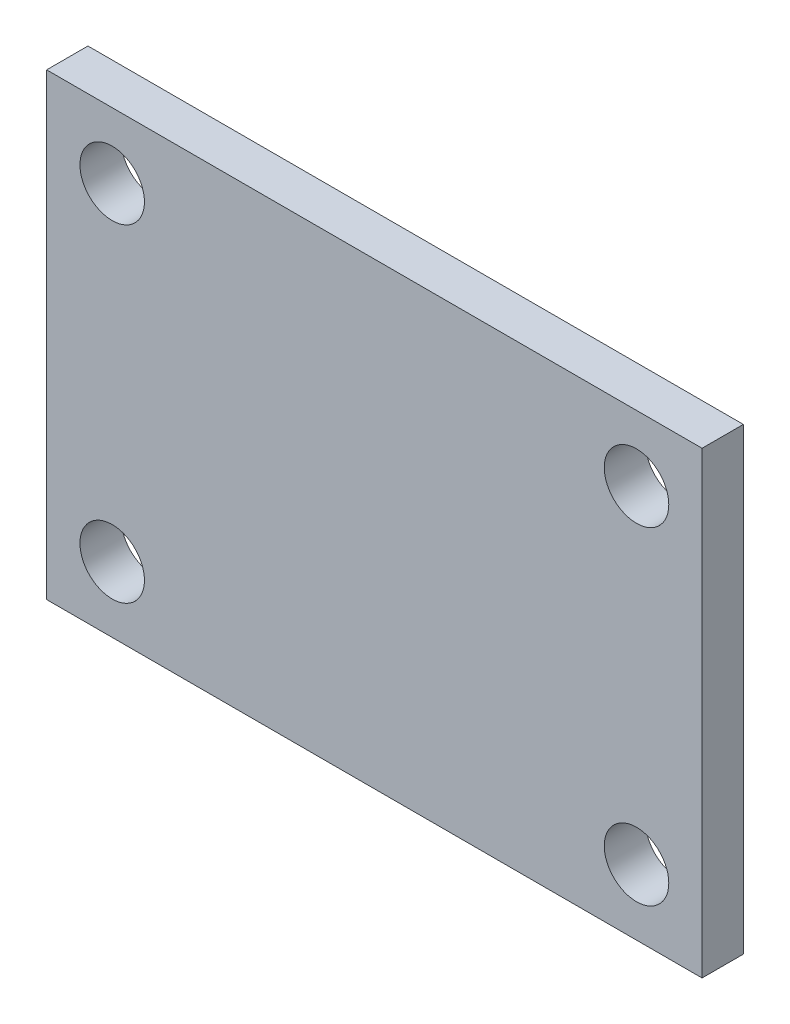
ISO-10303-21;
HEADER;
FILE_DESCRIPTION(('STEP AP214'),'2;1');
FILE_NAME('part.step','',(''),(''),'','','');
FILE_SCHEMA(('AUTOMOTIVE_DESIGN { 1 0 10303 214 1 1 1 1 }'));
ENDSEC;
DATA;
#1=APPLICATION_CONTEXT('core data for automotive mechanical design processes');
#2=APPLICATION_PROTOCOL_DEFINITION('international standard','automotive_design',2000,#1);
#3=PRODUCT_CONTEXT('',#1,'mechanical');
#4=PRODUCT('Part','Part','',(#3));
#5=PRODUCT_RELATED_PRODUCT_CATEGORY('part','',(#4));
#6=PRODUCT_DEFINITION_FORMATION('','',#4);
#7=PRODUCT_DEFINITION_CONTEXT('part definition',#1,'design');
#8=PRODUCT_DEFINITION('design','',#6,#7);
#9=PRODUCT_DEFINITION_SHAPE('','',#8);
#10=(LENGTH_UNIT() NAMED_UNIT(*) SI_UNIT(.MILLI.,.METRE.));
#11=(NAMED_UNIT(*) PLANE_ANGLE_UNIT() SI_UNIT($,.RADIAN.));
#12=(NAMED_UNIT(*) SI_UNIT($,.STERADIAN.) SOLID_ANGLE_UNIT());
#13=UNCERTAINTY_MEASURE_WITH_UNIT(LENGTH_MEASURE(1.E-05),#10,'distance_accuracy_value','');
#14=(GEOMETRIC_REPRESENTATION_CONTEXT(3) GLOBAL_UNCERTAINTY_ASSIGNED_CONTEXT((#13)) GLOBAL_UNIT_ASSIGNED_CONTEXT((#10,
#11,#12)) REPRESENTATION_CONTEXT('',''));
#15=CARTESIAN_POINT('',(0.,0.,0.));
#16=DIRECTION('',(0.,0.,1.));
#17=DIRECTION('',(1.,0.,0.));
#18=AXIS2_PLACEMENT_3D('',#15,#16,#17);
#19=CARTESIAN_POINT('',(0.,0.,-22.55));
#20=DIRECTION('',(0.,0.,-1.));
#21=DIRECTION('',(-1.,0.,0.));
#22=AXIS2_PLACEMENT_3D('',#19,#20,#21);
#23=PLANE('',#22);
#24=DIRECTION('',(0.,-1.,0.));
#25=VECTOR('',#24,1.);
#26=CARTESIAN_POINT('',(-0.2,-8.89,-22.55));
#27=LINE('',#26,#25);
#28=CARTESIAN_POINT('',(-0.2,8.89,-22.55));
#29=VERTEX_POINT('',#28);
#30=CARTESIAN_POINT('',(-0.2,-8.89,-22.55));
#31=VERTEX_POINT('',#30);
#32=EDGE_CURVE('E68',#29,#31,#27,.T.);
#33=ORIENTED_EDGE('',*,*,#32,.T.);
#34=DIRECTION('',(1.,0.,0.));
#35=VECTOR('',#34,1.);
#36=CARTESIAN_POINT('',(-0.2,-8.89,-22.55));
#37=LINE('',#36,#35);
#38=CARTESIAN_POINT('',(25.2,-8.89,-22.55));
#39=VERTEX_POINT('',#38);
#40=EDGE_CURVE('E64',#31,#39,#37,.T.);
#41=ORIENTED_EDGE('',*,*,#40,.T.);
#42=DIRECTION('',(0.,1.,0.));
#43=VECTOR('',#42,1.);
#44=CARTESIAN_POINT('',(25.2,-8.89,-22.55));
#45=LINE('',#44,#43);
#46=CARTESIAN_POINT('',(25.2,8.89,-22.55));
#47=VERTEX_POINT('',#46);
#48=EDGE_CURVE('E66',#39,#47,#45,.T.);
#49=ORIENTED_EDGE('',*,*,#48,.T.);
#50=DIRECTION('',(-1.,0.,0.));
#51=VECTOR('',#50,1.);
#52=CARTESIAN_POINT('',(-0.2,8.89,-22.55));
#53=LINE('',#52,#51);
#54=EDGE_CURVE('E31',#47,#29,#53,.T.);
#55=ORIENTED_EDGE('',*,*,#54,.T.);
#56=EDGE_LOOP('',(#33,#41,#49,#55));
#57=FACE_BOUND('',#56,.T.);
#58=CARTESIAN_POINT('',(2.34,6.35,-22.55));
#59=DIRECTION('',(0.,0.,1.));
#60=DIRECTION('',(1.,0.,0.));
#61=AXIS2_PLACEMENT_3D('',#58,#59,#60);
#62=CIRCLE('',#61,1.25);
#63=CARTESIAN_POINT('',(3.59,6.35,-22.55));
#64=VERTEX_POINT('',#63);
#65=EDGE_CURVE('E83',#64,#64,#62,.T.);
#66=ORIENTED_EDGE('',*,*,#65,.F.);
#67=EDGE_LOOP('',(#66));
#68=FACE_BOUND('',#67,.T.);
#69=CARTESIAN_POINT('',(22.66,6.35,-22.55));
#70=DIRECTION('',(0.,0.,1.));
#71=DIRECTION('',(1.,0.,0.));
#72=AXIS2_PLACEMENT_3D('',#69,#70,#71);
#73=CIRCLE('',#72,1.25);
#74=CARTESIAN_POINT('',(23.91,6.35,-22.55));
#75=VERTEX_POINT('',#74);
#76=EDGE_CURVE('E98',#75,#75,#73,.T.);
#77=ORIENTED_EDGE('',*,*,#76,.F.);
#78=EDGE_LOOP('',(#77));
#79=FACE_BOUND('',#78,.T.);
#80=CARTESIAN_POINT('',(2.34,-6.35,-22.55));
#81=DIRECTION('',(0.,0.,1.));
#82=DIRECTION('',(1.,0.,0.));
#83=AXIS2_PLACEMENT_3D('',#80,#81,#82);
#84=CIRCLE('',#83,1.25);
#85=CARTESIAN_POINT('',(3.59,-6.35,-22.55));
#86=VERTEX_POINT('',#85);
#87=EDGE_CURVE('E102',#86,#86,#84,.T.);
#88=ORIENTED_EDGE('',*,*,#87,.F.);
#89=EDGE_LOOP('',(#88));
#90=FACE_BOUND('',#89,.T.);
#91=CARTESIAN_POINT('',(22.66,-6.35,-22.55));
#92=DIRECTION('',(0.,0.,1.));
#93=DIRECTION('',(1.,0.,0.));
#94=AXIS2_PLACEMENT_3D('',#91,#92,#93);
#95=CIRCLE('',#94,1.25);
#96=CARTESIAN_POINT('',(23.91,-6.35,-22.55));
#97=VERTEX_POINT('',#96);
#98=EDGE_CURVE('E109',#97,#97,#95,.T.);
#99=ORIENTED_EDGE('',*,*,#98,.F.);
#100=EDGE_LOOP('',(#99));
#101=FACE_BOUND('',#100,.T.);
#102=ADVANCED_FACE('F16',(#57,#68,#79,#90,#101),#23,.F.);
#103=CARTESIAN_POINT('',(0.,0.,-24.15));
#104=DIRECTION('',(0.,0.,-1.));
#105=DIRECTION('',(-1.,0.,0.));
#106=AXIS2_PLACEMENT_3D('',#103,#104,#105);
#107=PLANE('',#106);
#108=CARTESIAN_POINT('',(2.34,-6.35,-24.15));
#109=DIRECTION('',(0.,0.,1.));
#110=DIRECTION('',(1.,0.,0.));
#111=AXIS2_PLACEMENT_3D('',#108,#109,#110);
#112=CIRCLE('',#111,1.25);
#113=CARTESIAN_POINT('',(3.59,-6.35,-24.15));
#114=VERTEX_POINT('',#113);
#115=EDGE_CURVE('E110',#114,#114,#112,.T.);
#116=ORIENTED_EDGE('',*,*,#115,.T.);
#117=EDGE_LOOP('',(#116));
#118=FACE_BOUND('',#117,.T.);
#119=CARTESIAN_POINT('',(2.34,6.35,-24.15));
#120=DIRECTION('',(0.,0.,1.));
#121=DIRECTION('',(1.,0.,0.));
#122=AXIS2_PLACEMENT_3D('',#119,#120,#121);
#123=CIRCLE('',#122,1.25);
#124=CARTESIAN_POINT('',(3.59,6.35,-24.15));
#125=VERTEX_POINT('',#124);
#126=EDGE_CURVE('E92',#125,#125,#123,.T.);
#127=ORIENTED_EDGE('',*,*,#126,.T.);
#128=EDGE_LOOP('',(#127));
#129=FACE_BOUND('',#128,.T.);
#130=DIRECTION('',(0.,-1.,0.));
#131=VECTOR('',#130,1.);
#132=CARTESIAN_POINT('',(-0.2,-8.89,-24.15));
#133=LINE('',#132,#131);
#134=CARTESIAN_POINT('',(-0.2,8.89,-24.15));
#135=VERTEX_POINT('',#134);
#136=CARTESIAN_POINT('',(-0.2,-8.89,-24.15));
#137=VERTEX_POINT('',#136);
#138=EDGE_CURVE('E79',#135,#137,#133,.T.);
#139=ORIENTED_EDGE('',*,*,#138,.F.);
#140=DIRECTION('',(-1.,0.,0.));
#141=VECTOR('',#140,1.);
#142=CARTESIAN_POINT('',(-0.2,8.89,-24.15));
#143=LINE('',#142,#141);
#144=CARTESIAN_POINT('',(25.2,8.89,-24.15));
#145=VERTEX_POINT('',#144);
#146=EDGE_CURVE('E57',#145,#135,#143,.T.);
#147=ORIENTED_EDGE('',*,*,#146,.F.);
#148=DIRECTION('',(0.,1.,0.));
#149=VECTOR('',#148,1.);
#150=CARTESIAN_POINT('',(25.2,-8.89,-24.15));
#151=LINE('',#150,#149);
#152=CARTESIAN_POINT('',(25.2,-8.89,-24.15));
#153=VERTEX_POINT('',#152);
#154=EDGE_CURVE('E49',#153,#145,#151,.T.);
#155=ORIENTED_EDGE('',*,*,#154,.F.);
#156=DIRECTION('',(1.,0.,0.));
#157=VECTOR('',#156,1.);
#158=CARTESIAN_POINT('',(-0.2,-8.89,-24.15));
#159=LINE('',#158,#157);
#160=EDGE_CURVE('E71',#137,#153,#159,.T.);
#161=ORIENTED_EDGE('',*,*,#160,.F.);
#162=EDGE_LOOP('',(#139,#147,#155,#161));
#163=FACE_BOUND('',#162,.T.);
#164=CARTESIAN_POINT('',(22.66,6.35,-24.15));
#165=DIRECTION('',(0.,0.,1.));
#166=DIRECTION('',(1.,0.,0.));
#167=AXIS2_PLACEMENT_3D('',#164,#165,#166);
#168=CIRCLE('',#167,1.25);
#169=CARTESIAN_POINT('',(23.91,6.35,-24.15));
#170=VERTEX_POINT('',#169);
#171=EDGE_CURVE('E101',#170,#170,#168,.T.);
#172=ORIENTED_EDGE('',*,*,#171,.T.);
#173=EDGE_LOOP('',(#172));
#174=FACE_BOUND('',#173,.T.);
#175=CARTESIAN_POINT('',(22.66,-6.35,-24.15));
#176=DIRECTION('',(0.,0.,1.));
#177=DIRECTION('',(1.,0.,0.));
#178=AXIS2_PLACEMENT_3D('',#175,#176,#177);
#179=CIRCLE('',#178,1.25);
#180=CARTESIAN_POINT('',(23.91,-6.35,-24.15));
#181=VERTEX_POINT('',#180);
#182=EDGE_CURVE('E114',#181,#181,#179,.T.);
#183=ORIENTED_EDGE('',*,*,#182,.T.);
#184=EDGE_LOOP('',(#183));
#185=FACE_BOUND('',#184,.T.);
#186=ADVANCED_FACE('F93',(#118,#129,#163,#174,#185),#107,.T.);
#187=CARTESIAN_POINT('',(-0.2,-8.89,-22.55));
#188=DIRECTION('',(1.,0.,0.));
#189=DIRECTION('',(0.,0.,-1.));
#190=AXIS2_PLACEMENT_3D('',#187,#188,#189);
#191=PLANE('',#190);
#192=ORIENTED_EDGE('',*,*,#138,.T.);
#193=DIRECTION('',(0.,0.,-1.));
#194=VECTOR('',#193,1.);
#195=CARTESIAN_POINT('',(-0.2,-8.89,-22.55));
#196=LINE('',#195,#194);
#197=EDGE_CURVE('E10',#31,#137,#196,.T.);
#198=ORIENTED_EDGE('',*,*,#197,.F.);
#199=ORIENTED_EDGE('',*,*,#32,.F.);
#200=DIRECTION('',(0.,0.,-1.));
#201=VECTOR('',#200,1.);
#202=CARTESIAN_POINT('',(-0.2,8.89,-22.55));
#203=LINE('',#202,#201);
#204=EDGE_CURVE('E76',#29,#135,#203,.T.);
#205=ORIENTED_EDGE('',*,*,#204,.T.);
#206=EDGE_LOOP('',(#192,#198,#199,#205));
#207=FACE_BOUND('',#206,.T.);
#208=ADVANCED_FACE('F18',(#207),#191,.F.);
#209=CARTESIAN_POINT('',(-0.2,-8.89,-22.55));
#210=DIRECTION('',(0.,1.,0.));
#211=DIRECTION('',(0.,0.,1.));
#212=AXIS2_PLACEMENT_3D('',#209,#210,#211);
#213=PLANE('',#212);
#214=ORIENTED_EDGE('',*,*,#160,.T.);
#215=DIRECTION('',(0.,0.,-1.));
#216=VECTOR('',#215,1.);
#217=CARTESIAN_POINT('',(25.2,-8.89,-22.55));
#218=LINE('',#217,#216);
#219=EDGE_CURVE('E25',#39,#153,#218,.T.);
#220=ORIENTED_EDGE('',*,*,#219,.F.);
#221=ORIENTED_EDGE('',*,*,#40,.F.);
#222=ORIENTED_EDGE('',*,*,#197,.T.);
#223=EDGE_LOOP('',(#214,#220,#221,#222));
#224=FACE_BOUND('',#223,.T.);
#225=ADVANCED_FACE('F75',(#224),#213,.F.);
#226=CARTESIAN_POINT('',(25.2,-8.89,-22.55));
#227=DIRECTION('',(-1.,0.,0.));
#228=DIRECTION('',(0.,0.,1.));
#229=AXIS2_PLACEMENT_3D('',#226,#227,#228);
#230=PLANE('',#229);
#231=ORIENTED_EDGE('',*,*,#154,.T.);
#232=DIRECTION('',(0.,0.,-1.));
#233=VECTOR('',#232,1.);
#234=CARTESIAN_POINT('',(25.2,8.89,-22.55));
#235=LINE('',#234,#233);
#236=EDGE_CURVE('E73',#47,#145,#235,.T.);
#237=ORIENTED_EDGE('',*,*,#236,.F.);
#238=ORIENTED_EDGE('',*,*,#48,.F.);
#239=ORIENTED_EDGE('',*,*,#219,.T.);
#240=EDGE_LOOP('',(#231,#237,#238,#239));
#241=FACE_BOUND('',#240,.T.);
#242=ADVANCED_FACE('F72',(#241),#230,.F.);
#243=CARTESIAN_POINT('',(-0.2,8.89,-22.55));
#244=DIRECTION('',(0.,-1.,0.));
#245=DIRECTION('',(0.,0.,-1.));
#246=AXIS2_PLACEMENT_3D('',#243,#244,#245);
#247=PLANE('',#246);
#248=ORIENTED_EDGE('',*,*,#146,.T.);
#249=ORIENTED_EDGE('',*,*,#204,.F.);
#250=ORIENTED_EDGE('',*,*,#54,.F.);
#251=ORIENTED_EDGE('',*,*,#236,.T.);
#252=EDGE_LOOP('',(#248,#249,#250,#251));
#253=FACE_BOUND('',#252,.T.);
#254=ADVANCED_FACE('F86',(#253),#247,.F.);
#255=CARTESIAN_POINT('',(2.34,6.35,-22.55));
#256=DIRECTION('',(0.,0.,-1.));
#257=DIRECTION('',(-1.,0.,0.));
#258=AXIS2_PLACEMENT_3D('',#255,#256,#257);
#259=CYLINDRICAL_SURFACE('',#258,1.25);
#260=ORIENTED_EDGE('',*,*,#65,.T.);
#261=EDGE_LOOP('',(#260));
#262=FACE_BOUND('',#261,.T.);
#263=ORIENTED_EDGE('',*,*,#126,.F.);
#264=EDGE_LOOP('',(#263));
#265=FACE_BOUND('',#264,.T.);
#266=ADVANCED_FACE('F135',(#262,#265),#259,.F.);
#267=CARTESIAN_POINT('',(22.66,6.35,-22.55));
#268=DIRECTION('',(0.,0.,-1.));
#269=DIRECTION('',(-1.,0.,0.));
#270=AXIS2_PLACEMENT_3D('',#267,#268,#269);
#271=CYLINDRICAL_SURFACE('',#270,1.25);
#272=ORIENTED_EDGE('',*,*,#76,.T.);
#273=EDGE_LOOP('',(#272));
#274=FACE_BOUND('',#273,.T.);
#275=ORIENTED_EDGE('',*,*,#171,.F.);
#276=EDGE_LOOP('',(#275));
#277=FACE_BOUND('',#276,.T.);
#278=ADVANCED_FACE('F184',(#274,#277),#271,.F.);
#279=CARTESIAN_POINT('',(2.34,-6.35,-22.55));
#280=DIRECTION('',(0.,0.,-1.));
#281=DIRECTION('',(-1.,0.,0.));
#282=AXIS2_PLACEMENT_3D('',#279,#280,#281);
#283=CYLINDRICAL_SURFACE('',#282,1.25);
#284=ORIENTED_EDGE('',*,*,#87,.T.);
#285=EDGE_LOOP('',(#284));
#286=FACE_BOUND('',#285,.T.);
#287=ORIENTED_EDGE('',*,*,#115,.F.);
#288=EDGE_LOOP('',(#287));
#289=FACE_BOUND('',#288,.T.);
#290=ADVANCED_FACE('F195',(#286,#289),#283,.F.);
#291=CARTESIAN_POINT('',(22.66,-6.35,-22.55));
#292=DIRECTION('',(0.,0.,-1.));
#293=DIRECTION('',(-1.,0.,0.));
#294=AXIS2_PLACEMENT_3D('',#291,#292,#293);
#295=CYLINDRICAL_SURFACE('',#294,1.25);
#296=ORIENTED_EDGE('',*,*,#98,.T.);
#297=EDGE_LOOP('',(#296));
#298=FACE_BOUND('',#297,.T.);
#299=ORIENTED_EDGE('',*,*,#182,.F.);
#300=EDGE_LOOP('',(#299));
#301=FACE_BOUND('',#300,.T.);
#302=ADVANCED_FACE('F118',(#298,#301),#295,.F.);
#303=CLOSED_SHELL('',(#102,#186,#208,#225,#242,#254,#266,#278,#290,#302));
#304=MANIFOLD_SOLID_BREP('B1',#303);
#305=ADVANCED_BREP_SHAPE_REPRESENTATION('',(#18,#304),#14);
#306=SHAPE_DEFINITION_REPRESENTATION(#9,#305);
ENDSEC;
END-ISO-10303-21;
